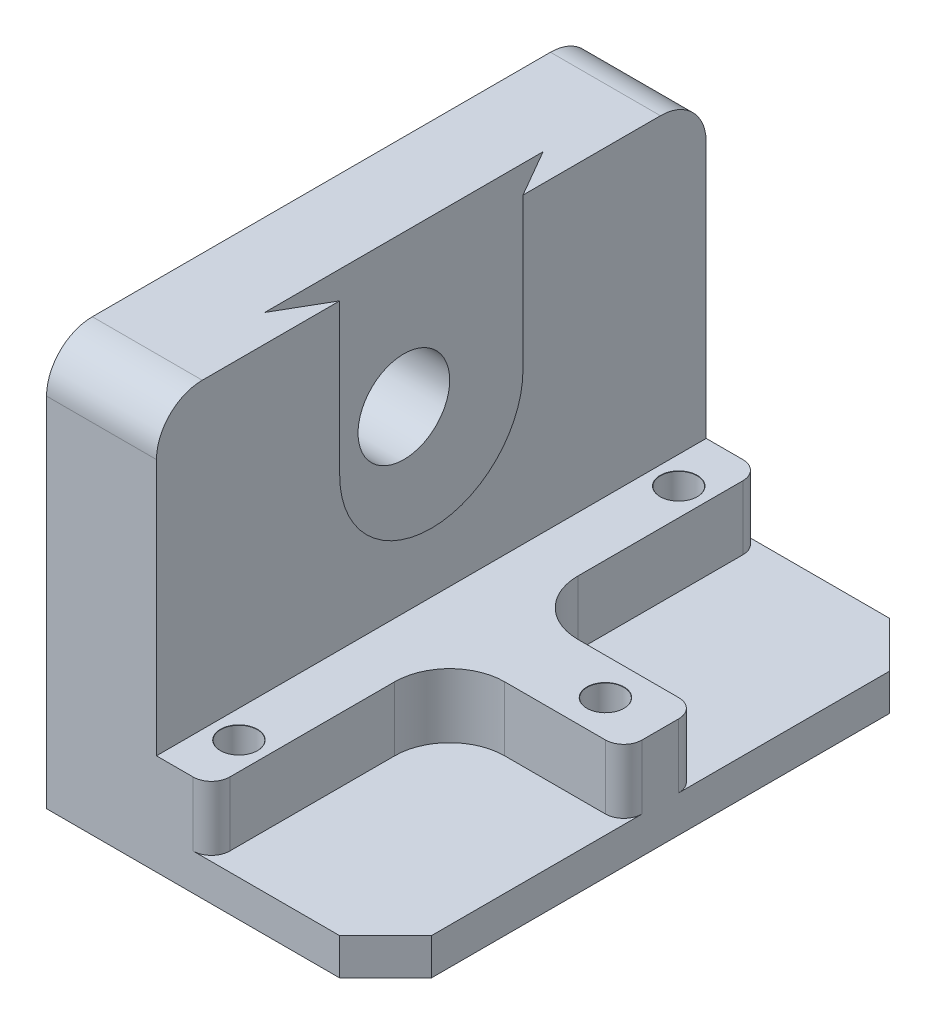
ISO-10303-21;
HEADER;
FILE_DESCRIPTION(('STEP AP214'),'2;1');
FILE_NAME('part.step','',(''),(''),'','','');
FILE_SCHEMA(('AUTOMOTIVE_DESIGN { 1 0 10303 214 1 1 1 1 }'));
ENDSEC;
DATA;
#1=APPLICATION_CONTEXT('core data for automotive mechanical design processes');
#2=APPLICATION_PROTOCOL_DEFINITION('international standard','automotive_design',2000,#1);
#3=PRODUCT_CONTEXT('',#1,'mechanical');
#4=PRODUCT('Part','Part','',(#3));
#5=PRODUCT_RELATED_PRODUCT_CATEGORY('part','',(#4));
#6=PRODUCT_DEFINITION_FORMATION('','',#4);
#7=PRODUCT_DEFINITION_CONTEXT('part definition',#1,'design');
#8=PRODUCT_DEFINITION('design','',#6,#7);
#9=PRODUCT_DEFINITION_SHAPE('','',#8);
#10=(LENGTH_UNIT() NAMED_UNIT(*) SI_UNIT(.MILLI.,.METRE.));
#11=(NAMED_UNIT(*) PLANE_ANGLE_UNIT() SI_UNIT($,.RADIAN.));
#12=(NAMED_UNIT(*) SI_UNIT($,.STERADIAN.) SOLID_ANGLE_UNIT());
#13=UNCERTAINTY_MEASURE_WITH_UNIT(LENGTH_MEASURE(1.E-05),#10,'distance_accuracy_value','');
#14=(GEOMETRIC_REPRESENTATION_CONTEXT(3) GLOBAL_UNCERTAINTY_ASSIGNED_CONTEXT((#13)) GLOBAL_UNIT_ASSIGNED_CONTEXT((#10,
#11,#12)) REPRESENTATION_CONTEXT('',''));
#15=CARTESIAN_POINT('',(0.,0.,0.));
#16=DIRECTION('',(0.,0.,1.));
#17=DIRECTION('',(1.,0.,0.));
#18=AXIS2_PLACEMENT_3D('',#15,#16,#17);
#19=CARTESIAN_POINT('',(12.,27.5,0.));
#20=DIRECTION('',(1.,0.,0.));
#21=DIRECTION('',(0.,0.,-1.));
#22=AXIS2_PLACEMENT_3D('',#19,#20,#21);
#23=CYLINDRICAL_SURFACE('',#22,5.);
#24=CARTESIAN_POINT('',(0.,27.5,0.));
#25=DIRECTION('',(1.,0.,0.));
#26=DIRECTION('',(0.,0.,-1.));
#27=AXIS2_PLACEMENT_3D('',#24,#25,#26);
#28=CIRCLE('',#27,5.);
#29=CARTESIAN_POINT('',(0.,27.5,-5.));
#30=VERTEX_POINT('',#29);
#31=EDGE_CURVE('E456',#30,#30,#28,.T.);
#32=ORIENTED_EDGE('',*,*,#31,.F.);
#33=EDGE_LOOP('',(#32));
#34=FACE_BOUND('',#33,.T.);
#35=CARTESIAN_POINT('',(9.00000000000001,27.5,0.));
#36=DIRECTION('',(1.,0.,0.));
#37=DIRECTION('',(0.,0.,-1.));
#38=AXIS2_PLACEMENT_3D('',#35,#36,#37);
#39=CIRCLE('',#38,5.);
#40=CARTESIAN_POINT('',(9.00000000000001,27.5,-5.));
#41=VERTEX_POINT('',#40);
#42=EDGE_CURVE('E405',#41,#41,#39,.F.);
#43=ORIENTED_EDGE('',*,*,#42,.F.);
#44=EDGE_LOOP('',(#43));
#45=FACE_BOUND('',#44,.T.);
#46=ADVANCED_FACE('F45',(#34,#45),#23,.F.);
#47=CARTESIAN_POINT('',(12.,4.,30.));
#48=DIRECTION('',(-1.,0.,0.));
#49=DIRECTION('',(0.,0.,1.));
#50=AXIS2_PLACEMENT_3D('',#47,#48,#49);
#51=PLANE('',#50);
#52=CARTESIAN_POINT('',(12.,27.5,0.));
#53=DIRECTION('',(1.,0.,0.));
#54=DIRECTION('',(0.,0.,-1.));
#55=AXIS2_PLACEMENT_3D('',#52,#53,#54);
#56=CIRCLE('',#55,10.);
#57=CARTESIAN_POINT('',(12.,27.5,10.));
#58=VERTEX_POINT('',#57);
#59=CARTESIAN_POINT('',(12.,27.5,-10.));
#60=VERTEX_POINT('',#59);
#61=EDGE_CURVE('E1023',#58,#60,#56,.T.);
#62=ORIENTED_EDGE('',*,*,#61,.F.);
#63=DIRECTION('',(0.,-1.,0.));
#64=VECTOR('',#63,1.);
#65=CARTESIAN_POINT('',(12.,42.375961669463,10.));
#66=LINE('',#65,#64);
#67=CARTESIAN_POINT('',(12.,44.,10.));
#68=VERTEX_POINT('',#67);
#69=EDGE_CURVE('E229',#68,#58,#66,.T.);
#70=ORIENTED_EDGE('',*,*,#69,.F.);
#71=DIRECTION('',(0.,0.,-1.));
#72=VECTOR('',#71,1.);
#73=CARTESIAN_POINT('',(12.,44.,30.));
#74=LINE('',#73,#72);
#75=CARTESIAN_POINT('',(12.,44.,25.));
#76=VERTEX_POINT('',#75);
#77=EDGE_CURVE('E246',#76,#68,#74,.T.);
#78=ORIENTED_EDGE('',*,*,#77,.F.);
#79=CARTESIAN_POINT('',(12.,39.,25.));
#80=DIRECTION('',(-1.,0.,0.));
#81=DIRECTION('',(0.,0.,1.));
#82=AXIS2_PLACEMENT_3D('',#79,#80,#81);
#83=CIRCLE('',#82,5.);
#84=CARTESIAN_POINT('',(12.,39.,30.));
#85=VERTEX_POINT('',#84);
#86=EDGE_CURVE('E69',#76,#85,#83,.F.);
#87=ORIENTED_EDGE('',*,*,#86,.T.);
#88=DIRECTION('',(0.,1.,0.));
#89=VECTOR('',#88,1.);
#90=CARTESIAN_POINT('',(12.,4.,30.));
#91=LINE('',#90,#89);
#92=CARTESIAN_POINT('',(12.,11.,30.));
#93=VERTEX_POINT('',#92);
#94=EDGE_CURVE('E247',#93,#85,#91,.T.);
#95=ORIENTED_EDGE('',*,*,#94,.F.);
#96=DIRECTION('',(0.,0.,1.));
#97=VECTOR('',#96,1.);
#98=CARTESIAN_POINT('',(12.,11.,-30.));
#99=LINE('',#98,#97);
#100=CARTESIAN_POINT('',(12.,11.,-30.));
#101=VERTEX_POINT('',#100);
#102=EDGE_CURVE('E461',#101,#93,#99,.T.);
#103=ORIENTED_EDGE('',*,*,#102,.F.);
#104=DIRECTION('',(0.,1.,0.));
#105=VECTOR('',#104,1.);
#106=CARTESIAN_POINT('',(12.,4.,-30.));
#107=LINE('',#106,#105);
#108=CARTESIAN_POINT('',(12.,39.,-30.));
#109=VERTEX_POINT('',#108);
#110=EDGE_CURVE('E256',#101,#109,#107,.T.);
#111=ORIENTED_EDGE('',*,*,#110,.T.);
#112=CARTESIAN_POINT('',(12.,39.,-25.));
#113=DIRECTION('',(-1.,0.,0.));
#114=DIRECTION('',(0.,0.,1.));
#115=AXIS2_PLACEMENT_3D('',#112,#113,#114);
#116=CIRCLE('',#115,5.);
#117=CARTESIAN_POINT('',(12.,44.,-25.));
#118=VERTEX_POINT('',#117);
#119=EDGE_CURVE('E243',#109,#118,#116,.F.);
#120=ORIENTED_EDGE('',*,*,#119,.T.);
#121=CARTESIAN_POINT('',(12.,44.,-10.));
#122=VERTEX_POINT('',#121);
#123=EDGE_CURVE('E235',#122,#118,#74,.T.);
#124=ORIENTED_EDGE('',*,*,#123,.F.);
#125=DIRECTION('',(0.,1.,0.));
#126=VECTOR('',#125,1.);
#127=CARTESIAN_POINT('',(12.,42.375961669463,-10.));
#128=LINE('',#127,#126);
#129=EDGE_CURVE('E220',#60,#122,#128,.T.);
#130=ORIENTED_EDGE('',*,*,#129,.F.);
#131=EDGE_LOOP('',(#62,#70,#78,#87,#95,#103,#111,#120,#124,#130));
#132=FACE_BOUND('',#131,.T.);
#133=ADVANCED_FACE('F240',(#132),#51,.F.);
#134=CARTESIAN_POINT('',(37.,4.,30.));
#135=DIRECTION('',(0.,-1.,0.));
#136=DIRECTION('',(1.,0.,0.));
#137=AXIS2_PLACEMENT_3D('',#134,#135,#136);
#138=PLANE('',#137);
#139=DIRECTION('',(1.,0.,0.));
#140=VECTOR('',#139,1.);
#141=CARTESIAN_POINT('',(18.,4.,4.));
#142=LINE('',#141,#140);
#143=CARTESIAN_POINT('',(24.,4.,4.));
#144=VERTEX_POINT('',#143);
#145=CARTESIAN_POINT('',(35.,4.,4.));
#146=VERTEX_POINT('',#145);
#147=EDGE_CURVE('E495',#144,#146,#142,.T.);
#148=ORIENTED_EDGE('',*,*,#147,.F.);
#149=CARTESIAN_POINT('',(24.,4.,10.));
#150=DIRECTION('',(0.,-1.,0.));
#151=DIRECTION('',(1.,0.,0.));
#152=AXIS2_PLACEMENT_3D('',#149,#150,#151);
#153=CIRCLE('',#152,6.);
#154=CARTESIAN_POINT('',(18.,4.,10.));
#155=VERTEX_POINT('',#154);
#156=EDGE_CURVE('E371',#144,#155,#153,.F.);
#157=ORIENTED_EDGE('',*,*,#156,.T.);
#158=DIRECTION('',(0.,0.,-1.));
#159=VECTOR('',#158,1.);
#160=CARTESIAN_POINT('',(18.,4.,30.));
#161=LINE('',#160,#159);
#162=CARTESIAN_POINT('',(18.,4.,28.));
#163=VERTEX_POINT('',#162);
#164=EDGE_CURVE('E460',#163,#155,#161,.T.);
#165=ORIENTED_EDGE('',*,*,#164,.F.);
#166=CARTESIAN_POINT('',(16.,4.,28.));
#167=DIRECTION('',(0.,-1.,0.));
#168=DIRECTION('',(1.,0.,0.));
#169=AXIS2_PLACEMENT_3D('',#166,#167,#168);
#170=CIRCLE('',#169,2.);
#171=CARTESIAN_POINT('',(16.,4.,30.));
#172=VERTEX_POINT('',#171);
#173=EDGE_CURVE('E353',#163,#172,#170,.T.);
#174=ORIENTED_EDGE('',*,*,#173,.T.);
#175=DIRECTION('',(-1.,0.,0.));
#176=VECTOR('',#175,1.);
#177=CARTESIAN_POINT('',(37.,4.,30.));
#178=LINE('',#177,#176);
#179=CARTESIAN_POINT('',(32.,4.,30.));
#180=VERTEX_POINT('',#179);
#181=EDGE_CURVE('E252',#180,#172,#178,.T.);
#182=ORIENTED_EDGE('',*,*,#181,.F.);
#183=DIRECTION('',(0.707106781186549,0.,-0.707106781186546));
#184=VECTOR('',#183,1.);
#185=CARTESIAN_POINT('',(32.,4.,30.));
#186=LINE('',#185,#184);
#187=CARTESIAN_POINT('',(37.,4.,25.));
#188=VERTEX_POINT('',#187);
#189=EDGE_CURVE('E296',#180,#188,#186,.T.);
#190=ORIENTED_EDGE('',*,*,#189,.T.);
#191=DIRECTION('',(0.,0.,-1.));
#192=VECTOR('',#191,1.);
#193=CARTESIAN_POINT('',(37.,4.,30.));
#194=LINE('',#193,#192);
#195=CARTESIAN_POINT('',(37.,4.,2.));
#196=VERTEX_POINT('',#195);
#197=EDGE_CURVE('E258',#188,#196,#194,.T.);
#198=ORIENTED_EDGE('',*,*,#197,.T.);
#199=CARTESIAN_POINT('',(35.,4.,2.));
#200=DIRECTION('',(0.,-1.,0.));
#201=DIRECTION('',(1.,0.,0.));
#202=AXIS2_PLACEMENT_3D('',#199,#200,#201);
#203=CIRCLE('',#202,2.);
#204=EDGE_CURVE('E345',#196,#146,#203,.T.);
#205=ORIENTED_EDGE('',*,*,#204,.T.);
#206=EDGE_LOOP('',(#148,#157,#165,#174,#182,#190,#198,#205));
#207=FACE_BOUND('',#206,.T.);
#208=ADVANCED_FACE('F596',(#207),#138,.F.);
#209=DIRECTION('',(0.,0.,-1.));
#210=VECTOR('',#209,1.);
#211=CARTESIAN_POINT('',(18.,4.,-30.));
#212=LINE('',#211,#210);
#213=CARTESIAN_POINT('',(18.,4.,-10.));
#214=VERTEX_POINT('',#213);
#215=CARTESIAN_POINT('',(18.,4.,-28.));
#216=VERTEX_POINT('',#215);
#217=EDGE_CURVE('E466',#214,#216,#212,.T.);
#218=ORIENTED_EDGE('',*,*,#217,.F.);
#219=CARTESIAN_POINT('',(24.,4.,-10.));
#220=DIRECTION('',(0.,-1.,0.));
#221=DIRECTION('',(1.,0.,0.));
#222=AXIS2_PLACEMENT_3D('',#219,#220,#221);
#223=CIRCLE('',#222,6.);
#224=CARTESIAN_POINT('',(24.,4.,-4.));
#225=VERTEX_POINT('',#224);
#226=EDGE_CURVE('E361',#214,#225,#223,.F.);
#227=ORIENTED_EDGE('',*,*,#226,.T.);
#228=DIRECTION('',(-1.,0.,0.));
#229=VECTOR('',#228,1.);
#230=CARTESIAN_POINT('',(18.,4.,-4.));
#231=LINE('',#230,#229);
#232=CARTESIAN_POINT('',(35.,4.,-4.));
#233=VERTEX_POINT('',#232);
#234=EDGE_CURVE('E498',#233,#225,#231,.T.);
#235=ORIENTED_EDGE('',*,*,#234,.F.);
#236=CARTESIAN_POINT('',(35.,4.,-2.));
#237=DIRECTION('',(0.,-1.,0.));
#238=DIRECTION('',(1.,0.,0.));
#239=AXIS2_PLACEMENT_3D('',#236,#237,#238);
#240=CIRCLE('',#239,2.);
#241=CARTESIAN_POINT('',(37.,4.,-2.));
#242=VERTEX_POINT('',#241);
#243=EDGE_CURVE('E341',#233,#242,#240,.T.);
#244=ORIENTED_EDGE('',*,*,#243,.T.);
#245=CARTESIAN_POINT('',(37.,4.,-25.));
#246=VERTEX_POINT('',#245);
#247=EDGE_CURVE('E251',#242,#246,#194,.T.);
#248=ORIENTED_EDGE('',*,*,#247,.T.);
#249=DIRECTION('',(0.707106781186549,0.,0.707106781186546));
#250=VECTOR('',#249,1.);
#251=CARTESIAN_POINT('',(37.,4.,-25.));
#252=LINE('',#251,#250);
#253=CARTESIAN_POINT('',(32.,4.,-30.));
#254=VERTEX_POINT('',#253);
#255=EDGE_CURVE('E280',#246,#254,#252,.F.);
#256=ORIENTED_EDGE('',*,*,#255,.T.);
#257=DIRECTION('',(-1.,0.,0.));
#258=VECTOR('',#257,1.);
#259=CARTESIAN_POINT('',(37.,4.,-30.));
#260=LINE('',#259,#258);
#261=CARTESIAN_POINT('',(16.,4.,-30.));
#262=VERTEX_POINT('',#261);
#263=EDGE_CURVE('E518',#254,#262,#260,.T.);
#264=ORIENTED_EDGE('',*,*,#263,.T.);
#265=CARTESIAN_POINT('',(16.,4.,-28.));
#266=DIRECTION('',(0.,-1.,0.));
#267=DIRECTION('',(1.,0.,0.));
#268=AXIS2_PLACEMENT_3D('',#265,#266,#267);
#269=CIRCLE('',#268,2.);
#270=EDGE_CURVE('E349',#262,#216,#269,.T.);
#271=ORIENTED_EDGE('',*,*,#270,.T.);
#272=EDGE_LOOP('',(#218,#227,#235,#244,#248,#256,#264,#271));
#273=FACE_BOUND('',#272,.T.);
#274=ADVANCED_FACE('F554',(#273),#138,.F.);
#275=CARTESIAN_POINT('',(12.,44.,30.));
#276=DIRECTION('',(0.,-1.,0.));
#277=DIRECTION('',(1.,0.,0.));
#278=AXIS2_PLACEMENT_3D('',#275,#276,#277);
#279=PLANE('',#278);
#280=ORIENTED_EDGE('',*,*,#77,.T.);
#281=DIRECTION('',(-0.499999999999998,0.,0.86602540378444));
#282=VECTOR('',#281,1.);
#283=CARTESIAN_POINT('',(3.33974596215564,44.,25.));
#284=LINE('',#283,#282);
#285=CARTESIAN_POINT('',(9.00000000000001,44.,15.1961524227067));
#286=VERTEX_POINT('',#285);
#287=EDGE_CURVE('E11',#68,#286,#284,.T.);
#288=ORIENTED_EDGE('',*,*,#287,.T.);
#289=DIRECTION('',(0.,0.,1.));
#290=VECTOR('',#289,1.);
#291=CARTESIAN_POINT('',(9.00000000000001,44.,30.));
#292=LINE('',#291,#290);
#293=CARTESIAN_POINT('',(9.00000000000001,44.,-15.1961524227067));
#294=VERTEX_POINT('',#293);
#295=EDGE_CURVE('E237',#294,#286,#292,.T.);
#296=ORIENTED_EDGE('',*,*,#295,.F.);
#297=DIRECTION('',(0.499999999999998,0.,0.86602540378444));
#298=VECTOR('',#297,1.);
#299=CARTESIAN_POINT('',(29.3205080756887,44.,20.0000000000001));
#300=LINE('',#299,#298);
#301=EDGE_CURVE('E54',#294,#122,#300,.T.);
#302=ORIENTED_EDGE('',*,*,#301,.T.);
#303=ORIENTED_EDGE('',*,*,#123,.T.);
#304=DIRECTION('',(-1.,0.,0.));
#305=VECTOR('',#304,1.);
#306=CARTESIAN_POINT('',(12.,44.,-25.));
#307=LINE('',#306,#305);
#308=CARTESIAN_POINT('',(0.,44.,-25.));
#309=VERTEX_POINT('',#308);
#310=EDGE_CURVE('E386',#118,#309,#307,.T.);
#311=ORIENTED_EDGE('',*,*,#310,.T.);
#312=DIRECTION('',(0.,0.,-1.));
#313=VECTOR('',#312,1.);
#314=CARTESIAN_POINT('',(0.,44.,30.));
#315=LINE('',#314,#313);
#316=CARTESIAN_POINT('',(0.,44.,25.));
#317=VERTEX_POINT('',#316);
#318=EDGE_CURVE('E269',#317,#309,#315,.T.);
#319=ORIENTED_EDGE('',*,*,#318,.F.);
#320=DIRECTION('',(-1.,0.,0.));
#321=VECTOR('',#320,1.);
#322=CARTESIAN_POINT('',(12.,44.,25.));
#323=LINE('',#322,#321);
#324=EDGE_CURVE('E383',#317,#76,#323,.F.);
#325=ORIENTED_EDGE('',*,*,#324,.T.);
#326=EDGE_LOOP('',(#280,#288,#296,#302,#303,#311,#319,#325));
#327=FACE_BOUND('',#326,.T.);
#328=ADVANCED_FACE('F233',(#327),#279,.F.);
#329=CARTESIAN_POINT('',(0.,44.,30.));
#330=DIRECTION('',(1.,0.,0.));
#331=DIRECTION('',(0.,0.,-1.));
#332=AXIS2_PLACEMENT_3D('',#329,#330,#331);
#333=PLANE('',#332);
#334=ORIENTED_EDGE('',*,*,#31,.T.);
#335=EDGE_LOOP('',(#334));
#336=FACE_BOUND('',#335,.T.);
#337=ORIENTED_EDGE('',*,*,#318,.T.);
#338=CARTESIAN_POINT('',(0.,39.,-25.));
#339=DIRECTION('',(1.,0.,0.));
#340=DIRECTION('',(0.,0.,-1.));
#341=AXIS2_PLACEMENT_3D('',#338,#339,#340);
#342=CIRCLE('',#341,5.);
#343=CARTESIAN_POINT('',(0.,39.,-30.));
#344=VERTEX_POINT('',#343);
#345=EDGE_CURVE('E392',#309,#344,#342,.F.);
#346=ORIENTED_EDGE('',*,*,#345,.T.);
#347=DIRECTION('',(0.,-1.,0.));
#348=VECTOR('',#347,1.);
#349=CARTESIAN_POINT('',(0.,44.,-30.));
#350=LINE('',#349,#348);
#351=CARTESIAN_POINT('',(0.,0.,-30.));
#352=VERTEX_POINT('',#351);
#353=EDGE_CURVE('E491',#344,#352,#350,.T.);
#354=ORIENTED_EDGE('',*,*,#353,.T.);
#355=DIRECTION('',(0.,0.,-1.));
#356=VECTOR('',#355,1.);
#357=CARTESIAN_POINT('',(0.,0.,30.));
#358=LINE('',#357,#356);
#359=CARTESIAN_POINT('',(0.,0.,30.));
#360=VERTEX_POINT('',#359);
#361=EDGE_CURVE('E265',#360,#352,#358,.T.);
#362=ORIENTED_EDGE('',*,*,#361,.F.);
#363=DIRECTION('',(0.,-1.,0.));
#364=VECTOR('',#363,1.);
#365=CARTESIAN_POINT('',(0.,44.,30.));
#366=LINE('',#365,#364);
#367=CARTESIAN_POINT('',(0.,39.,30.));
#368=VERTEX_POINT('',#367);
#369=EDGE_CURVE('E504',#368,#360,#366,.T.);
#370=ORIENTED_EDGE('',*,*,#369,.F.);
#371=CARTESIAN_POINT('',(0.,39.,25.));
#372=DIRECTION('',(1.,0.,0.));
#373=DIRECTION('',(0.,0.,-1.));
#374=AXIS2_PLACEMENT_3D('',#371,#372,#373);
#375=CIRCLE('',#374,5.);
#376=EDGE_CURVE('E389',#368,#317,#375,.F.);
#377=ORIENTED_EDGE('',*,*,#376,.T.);
#378=EDGE_LOOP('',(#337,#346,#354,#362,#370,#377));
#379=FACE_BOUND('',#378,.T.);
#380=ADVANCED_FACE('F534',(#336,#379),#333,.F.);
#381=CARTESIAN_POINT('',(0.,0.,30.));
#382=DIRECTION('',(0.,1.,0.));
#383=DIRECTION('',(0.,0.,1.));
#384=AXIS2_PLACEMENT_3D('',#381,#382,#383);
#385=PLANE('',#384);
#386=CARTESIAN_POINT('',(31.,0.,0.));
#387=DIRECTION('',(0.,1.,0.));
#388=DIRECTION('',(0.,0.,1.));
#389=AXIS2_PLACEMENT_3D('',#386,#387,#388);
#390=CIRCLE('',#389,2.);
#391=CARTESIAN_POINT('',(31.,0.,2.));
#392=VERTEX_POINT('',#391);
#393=EDGE_CURVE('E428',#392,#392,#390,.T.);
#394=ORIENTED_EDGE('',*,*,#393,.T.);
#395=EDGE_LOOP('',(#394));
#396=FACE_BOUND('',#395,.T.);
#397=CARTESIAN_POINT('',(15.,0.,24.));
#398=DIRECTION('',(0.,1.,0.));
#399=DIRECTION('',(0.,0.,1.));
#400=AXIS2_PLACEMENT_3D('',#397,#398,#399);
#401=CIRCLE('',#400,2.);
#402=CARTESIAN_POINT('',(15.,0.,26.));
#403=VERTEX_POINT('',#402);
#404=EDGE_CURVE('E440',#403,#403,#401,.T.);
#405=ORIENTED_EDGE('',*,*,#404,.T.);
#406=EDGE_LOOP('',(#405));
#407=FACE_BOUND('',#406,.T.);
#408=CARTESIAN_POINT('',(15.,0.,-24.));
#409=DIRECTION('',(0.,1.,0.));
#410=DIRECTION('',(0.,0.,1.));
#411=AXIS2_PLACEMENT_3D('',#408,#409,#410);
#412=CIRCLE('',#411,2.);
#413=CARTESIAN_POINT('',(15.,0.,-22.));
#414=VERTEX_POINT('',#413);
#415=EDGE_CURVE('E452',#414,#414,#412,.T.);
#416=ORIENTED_EDGE('',*,*,#415,.T.);
#417=EDGE_LOOP('',(#416));
#418=FACE_BOUND('',#417,.T.);
#419=DIRECTION('',(1.,0.,0.));
#420=VECTOR('',#419,1.);
#421=CARTESIAN_POINT('',(0.,0.,-30.));
#422=LINE('',#421,#420);
#423=CARTESIAN_POINT('',(32.,0.,-30.));
#424=VERTEX_POINT('',#423);
#425=EDGE_CURVE('E515',#352,#424,#422,.T.);
#426=ORIENTED_EDGE('',*,*,#425,.T.);
#427=DIRECTION('',(-0.707106781186549,0.,-0.707106781186546));
#428=VECTOR('',#427,1.);
#429=CARTESIAN_POINT('',(37.,0.,-25.));
#430=LINE('',#429,#428);
#431=CARTESIAN_POINT('',(37.,0.,-25.));
#432=VERTEX_POINT('',#431);
#433=EDGE_CURVE('E289',#424,#432,#430,.F.);
#434=ORIENTED_EDGE('',*,*,#433,.T.);
#435=DIRECTION('',(0.,0.,-1.));
#436=VECTOR('',#435,1.);
#437=CARTESIAN_POINT('',(37.,0.,30.));
#438=LINE('',#437,#436);
#439=CARTESIAN_POINT('',(37.,0.,25.));
#440=VERTEX_POINT('',#439);
#441=EDGE_CURVE('E261',#440,#432,#438,.T.);
#442=ORIENTED_EDGE('',*,*,#441,.F.);
#443=DIRECTION('',(-0.707106781186549,0.,0.707106781186546));
#444=VECTOR('',#443,1.);
#445=CARTESIAN_POINT('',(32.,0.,30.));
#446=LINE('',#445,#444);
#447=CARTESIAN_POINT('',(32.,0.,30.));
#448=VERTEX_POINT('',#447);
#449=EDGE_CURVE('E286',#440,#448,#446,.T.);
#450=ORIENTED_EDGE('',*,*,#449,.T.);
#451=DIRECTION('',(1.,0.,0.));
#452=VECTOR('',#451,1.);
#453=CARTESIAN_POINT('',(0.,0.,30.));
#454=LINE('',#453,#452);
#455=EDGE_CURVE('E507',#360,#448,#454,.T.);
#456=ORIENTED_EDGE('',*,*,#455,.F.);
#457=ORIENTED_EDGE('',*,*,#361,.T.);
#458=EDGE_LOOP('',(#426,#434,#442,#450,#456,#457));
#459=FACE_BOUND('',#458,.T.);
#460=ADVANCED_FACE('F585',(#396,#407,#418,#459),#385,.F.);
#461=CARTESIAN_POINT('',(37.,0.,30.));
#462=DIRECTION('',(-1.,0.,0.));
#463=DIRECTION('',(0.,0.,1.));
#464=AXIS2_PLACEMENT_3D('',#461,#462,#463);
#465=PLANE('',#464);
#466=ORIENTED_EDGE('',*,*,#247,.F.);
#467=DIRECTION('',(0.,-1.,0.));
#468=VECTOR('',#467,1.);
#469=CARTESIAN_POINT('',(37.,0.,-2.));
#470=LINE('',#469,#468);
#471=CARTESIAN_POINT('',(37.,11.,-2.));
#472=VERTEX_POINT('',#471);
#473=EDGE_CURVE('E307',#242,#472,#470,.F.);
#474=ORIENTED_EDGE('',*,*,#473,.T.);
#475=DIRECTION('',(0.,0.,-1.));
#476=VECTOR('',#475,1.);
#477=CARTESIAN_POINT('',(37.,11.,-4.));
#478=LINE('',#477,#476);
#479=CARTESIAN_POINT('',(37.,11.,2.));
#480=VERTEX_POINT('',#479);
#481=EDGE_CURVE('E477',#480,#472,#478,.T.);
#482=ORIENTED_EDGE('',*,*,#481,.F.);
#483=DIRECTION('',(0.,-1.,0.));
#484=VECTOR('',#483,1.);
#485=CARTESIAN_POINT('',(37.,0.,2.));
#486=LINE('',#485,#484);
#487=EDGE_CURVE('E303',#480,#196,#486,.T.);
#488=ORIENTED_EDGE('',*,*,#487,.T.);
#489=ORIENTED_EDGE('',*,*,#197,.F.);
#490=DIRECTION('',(0.,-1.,0.));
#491=VECTOR('',#490,1.);
#492=CARTESIAN_POINT('',(37.,0.,25.));
#493=LINE('',#492,#491);
#494=EDGE_CURVE('E273',#188,#440,#493,.T.);
#495=ORIENTED_EDGE('',*,*,#494,.T.);
#496=ORIENTED_EDGE('',*,*,#441,.T.);
#497=DIRECTION('',(0.,1.,0.));
#498=VECTOR('',#497,1.);
#499=CARTESIAN_POINT('',(37.,0.,-25.));
#500=LINE('',#499,#498);
#501=EDGE_CURVE('E276',#432,#246,#500,.T.);
#502=ORIENTED_EDGE('',*,*,#501,.T.);
#503=EDGE_LOOP('',(#466,#474,#482,#488,#489,#495,#496,#502));
#504=FACE_BOUND('',#503,.T.);
#505=ADVANCED_FACE('F576',(#504),#465,.F.);
#506=CARTESIAN_POINT('',(0.,0.,30.));
#507=DIRECTION('',(0.,0.,1.));
#508=DIRECTION('',(1.,0.,0.));
#509=AXIS2_PLACEMENT_3D('',#506,#507,#508);
#510=PLANE('',#509);
#511=ORIENTED_EDGE('',*,*,#94,.T.);
#512=DIRECTION('',(-1.,0.,0.));
#513=VECTOR('',#512,1.);
#514=CARTESIAN_POINT('',(0.,39.,30.));
#515=LINE('',#514,#513);
#516=EDGE_CURVE('E239',#85,#368,#515,.T.);
#517=ORIENTED_EDGE('',*,*,#516,.T.);
#518=ORIENTED_EDGE('',*,*,#369,.T.);
#519=ORIENTED_EDGE('',*,*,#455,.T.);
#520=DIRECTION('',(0.,1.,0.));
#521=VECTOR('',#520,1.);
#522=CARTESIAN_POINT('',(32.,4.,30.));
#523=LINE('',#522,#521);
#524=EDGE_CURVE('E292',#448,#180,#523,.T.);
#525=ORIENTED_EDGE('',*,*,#524,.T.);
#526=ORIENTED_EDGE('',*,*,#181,.T.);
#527=DIRECTION('',(0.,-1.,0.));
#528=VECTOR('',#527,1.);
#529=CARTESIAN_POINT('',(16.,11.,30.));
#530=LINE('',#529,#528);
#531=CARTESIAN_POINT('',(16.,11.,30.));
#532=VERTEX_POINT('',#531);
#533=EDGE_CURVE('E338',#172,#532,#530,.F.);
#534=ORIENTED_EDGE('',*,*,#533,.T.);
#535=DIRECTION('',(1.,0.,0.));
#536=VECTOR('',#535,1.);
#537=CARTESIAN_POINT('',(12.,11.,30.));
#538=LINE('',#537,#536);
#539=EDGE_CURVE('E465',#93,#532,#538,.T.);
#540=ORIENTED_EDGE('',*,*,#539,.F.);
#541=EDGE_LOOP('',(#511,#517,#518,#519,#525,#526,#534,#540));
#542=FACE_BOUND('',#541,.T.);
#543=ADVANCED_FACE('F541',(#542),#510,.T.);
#544=CARTESIAN_POINT('',(0.,0.,-30.));
#545=DIRECTION('',(0.,0.,1.));
#546=DIRECTION('',(1.,0.,0.));
#547=AXIS2_PLACEMENT_3D('',#544,#545,#546);
#548=PLANE('',#547);
#549=ORIENTED_EDGE('',*,*,#353,.F.);
#550=DIRECTION('',(-1.,0.,0.));
#551=VECTOR('',#550,1.);
#552=CARTESIAN_POINT('',(0.,39.,-30.));
#553=LINE('',#552,#551);
#554=EDGE_CURVE('E395',#344,#109,#553,.F.);
#555=ORIENTED_EDGE('',*,*,#554,.T.);
#556=ORIENTED_EDGE('',*,*,#110,.F.);
#557=DIRECTION('',(-1.,0.,0.));
#558=VECTOR('',#557,1.);
#559=CARTESIAN_POINT('',(12.,11.,-30.));
#560=LINE('',#559,#558);
#561=CARTESIAN_POINT('',(16.,11.,-30.));
#562=VERTEX_POINT('',#561);
#563=EDGE_CURVE('E488',#562,#101,#560,.T.);
#564=ORIENTED_EDGE('',*,*,#563,.F.);
#565=DIRECTION('',(0.,-1.,0.));
#566=VECTOR('',#565,1.);
#567=CARTESIAN_POINT('',(16.,0.,-30.));
#568=LINE('',#567,#566);
#569=EDGE_CURVE('E326',#562,#262,#568,.T.);
#570=ORIENTED_EDGE('',*,*,#569,.T.);
#571=ORIENTED_EDGE('',*,*,#263,.F.);
#572=DIRECTION('',(0.,-1.,0.));
#573=VECTOR('',#572,1.);
#574=CARTESIAN_POINT('',(32.,0.,-30.));
#575=LINE('',#574,#573);
#576=EDGE_CURVE('E283',#254,#424,#575,.T.);
#577=ORIENTED_EDGE('',*,*,#576,.T.);
#578=ORIENTED_EDGE('',*,*,#425,.F.);
#579=EDGE_LOOP('',(#549,#555,#556,#564,#570,#571,#577,#578));
#580=FACE_BOUND('',#579,.T.);
#581=ADVANCED_FACE('F549',(#580),#548,.F.);
#582=CARTESIAN_POINT('',(18.,11.,30.));
#583=DIRECTION('',(-1.,0.,0.));
#584=DIRECTION('',(0.,0.,1.));
#585=AXIS2_PLACEMENT_3D('',#582,#583,#584);
#586=PLANE('',#585);
#587=ORIENTED_EDGE('',*,*,#164,.T.);
#588=DIRECTION('',(0.,-1.,0.));
#589=VECTOR('',#588,1.);
#590=CARTESIAN_POINT('',(18.,11.,10.));
#591=LINE('',#590,#589);
#592=CARTESIAN_POINT('',(18.,11.,10.));
#593=VERTEX_POINT('',#592);
#594=EDGE_CURVE('E374',#155,#593,#591,.F.);
#595=ORIENTED_EDGE('',*,*,#594,.T.);
#596=DIRECTION('',(0.,0.,-1.));
#597=VECTOR('',#596,1.);
#598=CARTESIAN_POINT('',(18.,11.,30.));
#599=LINE('',#598,#597);
#600=CARTESIAN_POINT('',(18.,11.,28.));
#601=VERTEX_POINT('',#600);
#602=EDGE_CURVE('E470',#601,#593,#599,.T.);
#603=ORIENTED_EDGE('',*,*,#602,.F.);
#604=DIRECTION('',(0.,-1.,0.));
#605=VECTOR('',#604,1.);
#606=CARTESIAN_POINT('',(18.,4.,28.));
#607=LINE('',#606,#605);
#608=EDGE_CURVE('E334',#601,#163,#607,.T.);
#609=ORIENTED_EDGE('',*,*,#608,.T.);
#610=EDGE_LOOP('',(#587,#595,#603,#609));
#611=FACE_BOUND('',#610,.T.);
#612=ADVANCED_FACE('F614',(#611),#586,.F.);
#613=CARTESIAN_POINT('',(18.,11.,4.));
#614=DIRECTION('',(0.,0.,-1.));
#615=DIRECTION('',(-1.,0.,0.));
#616=AXIS2_PLACEMENT_3D('',#613,#614,#615);
#617=PLANE('',#616);
#618=DIRECTION('',(1.,0.,0.));
#619=VECTOR('',#618,1.);
#620=CARTESIAN_POINT('',(18.,11.,4.));
#621=LINE('',#620,#619);
#622=CARTESIAN_POINT('',(24.,11.,4.));
#623=VERTEX_POINT('',#622);
#624=CARTESIAN_POINT('',(35.,11.,4.));
#625=VERTEX_POINT('',#624);
#626=EDGE_CURVE('E474',#623,#625,#621,.T.);
#627=ORIENTED_EDGE('',*,*,#626,.F.);
#628=DIRECTION('',(0.,-1.,0.));
#629=VECTOR('',#628,1.);
#630=CARTESIAN_POINT('',(24.,4.,4.));
#631=LINE('',#630,#629);
#632=EDGE_CURVE('E367',#623,#144,#631,.T.);
#633=ORIENTED_EDGE('',*,*,#632,.T.);
#634=ORIENTED_EDGE('',*,*,#147,.T.);
#635=DIRECTION('',(0.,-1.,0.));
#636=VECTOR('',#635,1.);
#637=CARTESIAN_POINT('',(35.,11.,4.));
#638=LINE('',#637,#636);
#639=EDGE_CURVE('E322',#146,#625,#638,.F.);
#640=ORIENTED_EDGE('',*,*,#639,.T.);
#641=EDGE_LOOP('',(#627,#633,#634,#640));
#642=FACE_BOUND('',#641,.T.);
#643=ADVANCED_FACE('F606',(#642),#617,.F.);
#644=CARTESIAN_POINT('',(18.,11.,-4.));
#645=DIRECTION('',(0.,0.,1.));
#646=DIRECTION('',(1.,0.,0.));
#647=AXIS2_PLACEMENT_3D('',#644,#645,#646);
#648=PLANE('',#647);
#649=ORIENTED_EDGE('',*,*,#234,.T.);
#650=DIRECTION('',(0.,-1.,0.));
#651=VECTOR('',#650,1.);
#652=CARTESIAN_POINT('',(24.,11.,-4.));
#653=LINE('',#652,#651);
#654=CARTESIAN_POINT('',(24.,11.,-4.));
#655=VERTEX_POINT('',#654);
#656=EDGE_CURVE('E364',#225,#655,#653,.F.);
#657=ORIENTED_EDGE('',*,*,#656,.T.);
#658=DIRECTION('',(-1.,0.,0.));
#659=VECTOR('',#658,1.);
#660=CARTESIAN_POINT('',(18.,11.,-4.));
#661=LINE('',#660,#659);
#662=CARTESIAN_POINT('',(35.,11.,-4.));
#663=VERTEX_POINT('',#662);
#664=EDGE_CURVE('E481',#663,#655,#661,.T.);
#665=ORIENTED_EDGE('',*,*,#664,.F.);
#666=DIRECTION('',(0.,-1.,0.));
#667=VECTOR('',#666,1.);
#668=CARTESIAN_POINT('',(35.,11.,-4.));
#669=LINE('',#668,#667);
#670=EDGE_CURVE('E299',#663,#233,#669,.T.);
#671=ORIENTED_EDGE('',*,*,#670,.T.);
#672=EDGE_LOOP('',(#649,#657,#665,#671));
#673=FACE_BOUND('',#672,.T.);
#674=ADVANCED_FACE('F566',(#673),#648,.F.);
#675=CARTESIAN_POINT('',(18.,11.,-30.));
#676=DIRECTION('',(-1.,0.,0.));
#677=DIRECTION('',(0.,0.,1.));
#678=AXIS2_PLACEMENT_3D('',#675,#676,#677);
#679=PLANE('',#678);
#680=DIRECTION('',(0.,0.,-1.));
#681=VECTOR('',#680,1.);
#682=CARTESIAN_POINT('',(18.,11.,-30.));
#683=LINE('',#682,#681);
#684=CARTESIAN_POINT('',(18.,11.,-10.));
#685=VERTEX_POINT('',#684);
#686=CARTESIAN_POINT('',(18.,11.,-28.));
#687=VERTEX_POINT('',#686);
#688=EDGE_CURVE('E485',#685,#687,#683,.T.);
#689=ORIENTED_EDGE('',*,*,#688,.F.);
#690=DIRECTION('',(0.,-1.,0.));
#691=VECTOR('',#690,1.);
#692=CARTESIAN_POINT('',(18.,4.,-10.));
#693=LINE('',#692,#691);
#694=EDGE_CURVE('E357',#685,#214,#693,.T.);
#695=ORIENTED_EDGE('',*,*,#694,.T.);
#696=ORIENTED_EDGE('',*,*,#217,.T.);
#697=DIRECTION('',(0.,-1.,0.));
#698=VECTOR('',#697,1.);
#699=CARTESIAN_POINT('',(18.,11.,-28.));
#700=LINE('',#699,#698);
#701=EDGE_CURVE('E330',#216,#687,#700,.F.);
#702=ORIENTED_EDGE('',*,*,#701,.T.);
#703=EDGE_LOOP('',(#689,#695,#696,#702));
#704=FACE_BOUND('',#703,.T.);
#705=ADVANCED_FACE('F558',(#704),#679,.F.);
#706=CARTESIAN_POINT('',(0.,11.,0.));
#707=DIRECTION('',(0.,1.,0.));
#708=DIRECTION('',(-1.,0.,0.));
#709=AXIS2_PLACEMENT_3D('',#706,#707,#708);
#710=PLANE('',#709);
#711=CARTESIAN_POINT('',(31.,11.,0.));
#712=DIRECTION('',(0.,1.,0.));
#713=DIRECTION('',(0.,0.,1.));
#714=AXIS2_PLACEMENT_3D('',#711,#712,#713);
#715=CIRCLE('',#714,2.025);
#716=CARTESIAN_POINT('',(31.,11.,2.025));
#717=VERTEX_POINT('',#716);
#718=EDGE_CURVE('E412',#717,#717,#715,.T.);
#719=ORIENTED_EDGE('',*,*,#718,.F.);
#720=EDGE_LOOP('',(#719));
#721=FACE_BOUND('',#720,.T.);
#722=CARTESIAN_POINT('',(15.,11.,24.));
#723=DIRECTION('',(0.,1.,0.));
#724=DIRECTION('',(0.,0.,1.));
#725=AXIS2_PLACEMENT_3D('',#722,#723,#724);
#726=CIRCLE('',#725,2.025);
#727=CARTESIAN_POINT('',(15.,11.,26.025));
#728=VERTEX_POINT('',#727);
#729=EDGE_CURVE('E432',#728,#728,#726,.T.);
#730=ORIENTED_EDGE('',*,*,#729,.F.);
#731=EDGE_LOOP('',(#730));
#732=FACE_BOUND('',#731,.T.);
#733=CARTESIAN_POINT('',(15.,11.,-24.));
#734=DIRECTION('',(0.,1.,0.));
#735=DIRECTION('',(0.,0.,1.));
#736=AXIS2_PLACEMENT_3D('',#733,#734,#735);
#737=CIRCLE('',#736,2.025);
#738=CARTESIAN_POINT('',(15.,11.,-21.975));
#739=VERTEX_POINT('',#738);
#740=EDGE_CURVE('E444',#739,#739,#737,.T.);
#741=ORIENTED_EDGE('',*,*,#740,.F.);
#742=EDGE_LOOP('',(#741));
#743=FACE_BOUND('',#742,.T.);
#744=ORIENTED_EDGE('',*,*,#481,.T.);
#745=CARTESIAN_POINT('',(35.,11.,-2.));
#746=DIRECTION('',(0.,1.,0.));
#747=DIRECTION('',(-1.,0.,0.));
#748=AXIS2_PLACEMENT_3D('',#745,#746,#747);
#749=CIRCLE('',#748,2.);
#750=EDGE_CURVE('E319',#472,#663,#749,.T.);
#751=ORIENTED_EDGE('',*,*,#750,.T.);
#752=ORIENTED_EDGE('',*,*,#664,.T.);
#753=CARTESIAN_POINT('',(24.,11.,-10.));
#754=DIRECTION('',(0.,1.,0.));
#755=DIRECTION('',(-1.,0.,0.));
#756=AXIS2_PLACEMENT_3D('',#753,#754,#755);
#757=CIRCLE('',#756,6.);
#758=EDGE_CURVE('E377',#655,#685,#757,.F.);
#759=ORIENTED_EDGE('',*,*,#758,.T.);
#760=ORIENTED_EDGE('',*,*,#688,.T.);
#761=CARTESIAN_POINT('',(16.,11.,-28.));
#762=DIRECTION('',(0.,1.,0.));
#763=DIRECTION('',(-1.,0.,0.));
#764=AXIS2_PLACEMENT_3D('',#761,#762,#763);
#765=CIRCLE('',#764,2.);
#766=EDGE_CURVE('E313',#687,#562,#765,.T.);
#767=ORIENTED_EDGE('',*,*,#766,.T.);
#768=ORIENTED_EDGE('',*,*,#563,.T.);
#769=ORIENTED_EDGE('',*,*,#102,.T.);
#770=ORIENTED_EDGE('',*,*,#539,.T.);
#771=CARTESIAN_POINT('',(16.,11.,28.));
#772=DIRECTION('',(0.,1.,0.));
#773=DIRECTION('',(-1.,0.,0.));
#774=AXIS2_PLACEMENT_3D('',#771,#772,#773);
#775=CIRCLE('',#774,2.);
#776=EDGE_CURVE('E310',#532,#601,#775,.T.);
#777=ORIENTED_EDGE('',*,*,#776,.T.);
#778=ORIENTED_EDGE('',*,*,#602,.T.);
#779=CARTESIAN_POINT('',(24.,11.,10.));
#780=DIRECTION('',(0.,1.,0.));
#781=DIRECTION('',(-1.,0.,0.));
#782=AXIS2_PLACEMENT_3D('',#779,#780,#781);
#783=CIRCLE('',#782,6.);
#784=EDGE_CURVE('E380',#593,#623,#783,.F.);
#785=ORIENTED_EDGE('',*,*,#784,.T.);
#786=ORIENTED_EDGE('',*,*,#626,.T.);
#787=CARTESIAN_POINT('',(35.,11.,2.));
#788=DIRECTION('',(0.,1.,0.));
#789=DIRECTION('',(-1.,0.,0.));
#790=AXIS2_PLACEMENT_3D('',#787,#788,#789);
#791=CIRCLE('',#790,2.);
#792=EDGE_CURVE('E316',#625,#480,#791,.T.);
#793=ORIENTED_EDGE('',*,*,#792,.T.);
#794=EDGE_LOOP('',(#744,#751,#752,#759,#760,#767,#768,#769,#770,#777,#778,#785,#786,#793));
#795=FACE_BOUND('',#794,.T.);
#796=ADVANCED_FACE('F546',(#721,#732,#743,#795),#710,.T.);
#797=CARTESIAN_POINT('',(15.,11.,-24.));
#798=DIRECTION('',(0.,1.,0.));
#799=DIRECTION('',(0.,0.,1.));
#800=AXIS2_PLACEMENT_3D('',#797,#798,#799);
#801=CYLINDRICAL_SURFACE('',#800,2.);
#802=ORIENTED_EDGE('',*,*,#415,.F.);
#803=EDGE_LOOP('',(#802));
#804=FACE_BOUND('',#803,.T.);
#805=CARTESIAN_POINT('',(15.,10.975,-24.));
#806=DIRECTION('',(0.,1.,0.));
#807=DIRECTION('',(0.,0.,1.));
#808=AXIS2_PLACEMENT_3D('',#805,#806,#807);
#809=CIRCLE('',#808,2.);
#810=CARTESIAN_POINT('',(15.,10.975,-22.));
#811=VERTEX_POINT('',#810);
#812=EDGE_CURVE('E448',#811,#811,#809,.T.);
#813=ORIENTED_EDGE('',*,*,#812,.T.);
#814=EDGE_LOOP('',(#813));
#815=FACE_BOUND('',#814,.T.);
#816=ADVANCED_FACE('F637',(#804,#815),#801,.F.);
#817=CARTESIAN_POINT('',(15.,11.,-24.));
#818=DIRECTION('',(0.,1.,0.));
#819=DIRECTION('',(0.,0.,1.));
#820=AXIS2_PLACEMENT_3D('',#817,#818,#819);
#821=CONICAL_SURFACE('',#820,2.025,0.785398163397448);
#822=ORIENTED_EDGE('',*,*,#812,.F.);
#823=EDGE_LOOP('',(#822));
#824=FACE_BOUND('',#823,.T.);
#825=ORIENTED_EDGE('',*,*,#740,.T.);
#826=EDGE_LOOP('',(#825));
#827=FACE_BOUND('',#826,.T.);
#828=ADVANCED_FACE('F888',(#824,#827),#821,.F.);
#829=CARTESIAN_POINT('',(15.,11.,24.));
#830=DIRECTION('',(0.,1.,0.));
#831=DIRECTION('',(0.,0.,1.));
#832=AXIS2_PLACEMENT_3D('',#829,#830,#831);
#833=CYLINDRICAL_SURFACE('',#832,2.);
#834=ORIENTED_EDGE('',*,*,#404,.F.);
#835=EDGE_LOOP('',(#834));
#836=FACE_BOUND('',#835,.T.);
#837=CARTESIAN_POINT('',(15.,10.975,24.));
#838=DIRECTION('',(0.,1.,0.));
#839=DIRECTION('',(0.,0.,1.));
#840=AXIS2_PLACEMENT_3D('',#837,#838,#839);
#841=CIRCLE('',#840,2.);
#842=CARTESIAN_POINT('',(15.,10.975,26.));
#843=VERTEX_POINT('',#842);
#844=EDGE_CURVE('E436',#843,#843,#841,.T.);
#845=ORIENTED_EDGE('',*,*,#844,.T.);
#846=EDGE_LOOP('',(#845));
#847=FACE_BOUND('',#846,.T.);
#848=ADVANCED_FACE('F885',(#836,#847),#833,.F.);
#849=CARTESIAN_POINT('',(15.,11.,24.));
#850=DIRECTION('',(0.,1.,0.));
#851=DIRECTION('',(0.,0.,1.));
#852=AXIS2_PLACEMENT_3D('',#849,#850,#851);
#853=CONICAL_SURFACE('',#852,2.025,0.785398163397448);
#854=ORIENTED_EDGE('',*,*,#844,.F.);
#855=EDGE_LOOP('',(#854));
#856=FACE_BOUND('',#855,.T.);
#857=ORIENTED_EDGE('',*,*,#729,.T.);
#858=EDGE_LOOP('',(#857));
#859=FACE_BOUND('',#858,.T.);
#860=ADVANCED_FACE('F881',(#856,#859),#853,.F.);
#861=CARTESIAN_POINT('',(31.,11.,0.));
#862=DIRECTION('',(0.,1.,0.));
#863=DIRECTION('',(0.,0.,1.));
#864=AXIS2_PLACEMENT_3D('',#861,#862,#863);
#865=CYLINDRICAL_SURFACE('',#864,2.);
#866=ORIENTED_EDGE('',*,*,#393,.F.);
#867=EDGE_LOOP('',(#866));
#868=FACE_BOUND('',#867,.T.);
#869=CARTESIAN_POINT('',(31.,10.975,0.));
#870=DIRECTION('',(0.,1.,0.));
#871=DIRECTION('',(0.,0.,1.));
#872=AXIS2_PLACEMENT_3D('',#869,#870,#871);
#873=CIRCLE('',#872,2.);
#874=CARTESIAN_POINT('',(31.,10.975,2.));
#875=VERTEX_POINT('',#874);
#876=EDGE_CURVE('E424',#875,#875,#873,.T.);
#877=ORIENTED_EDGE('',*,*,#876,.T.);
#878=EDGE_LOOP('',(#877));
#879=FACE_BOUND('',#878,.T.);
#880=ADVANCED_FACE('F877',(#868,#879),#865,.F.);
#881=CARTESIAN_POINT('',(31.,11.,0.));
#882=DIRECTION('',(0.,1.,0.));
#883=DIRECTION('',(0.,0.,1.));
#884=AXIS2_PLACEMENT_3D('',#881,#882,#883);
#885=CONICAL_SURFACE('',#884,2.025,0.785398163397379);
#886=ORIENTED_EDGE('',*,*,#876,.F.);
#887=EDGE_LOOP('',(#886));
#888=FACE_BOUND('',#887,.T.);
#889=ORIENTED_EDGE('',*,*,#718,.T.);
#890=EDGE_LOOP('',(#889));
#891=FACE_BOUND('',#890,.T.);
#892=ADVANCED_FACE('F672',(#888,#891),#885,.F.);
#893=CARTESIAN_POINT('',(37.,0.,-25.));
#894=DIRECTION('',(-0.707106781186546,0.,0.707106781186549));
#895=DIRECTION('',(0.,1.,0.));
#896=AXIS2_PLACEMENT_3D('',#893,#894,#895);
#897=PLANE('',#896);
#898=ORIENTED_EDGE('',*,*,#433,.F.);
#899=ORIENTED_EDGE('',*,*,#576,.F.);
#900=ORIENTED_EDGE('',*,*,#255,.F.);
#901=ORIENTED_EDGE('',*,*,#501,.F.);
#902=EDGE_LOOP('',(#898,#899,#900,#901));
#903=FACE_BOUND('',#902,.T.);
#904=ADVANCED_FACE('F581',(#903),#897,.F.);
#905=CARTESIAN_POINT('',(32.,0.,30.));
#906=DIRECTION('',(0.707106781186546,0.,0.707106781186549));
#907=DIRECTION('',(0.,-1.,0.));
#908=AXIS2_PLACEMENT_3D('',#905,#906,#907);
#909=PLANE('',#908);
#910=ORIENTED_EDGE('',*,*,#449,.F.);
#911=ORIENTED_EDGE('',*,*,#494,.F.);
#912=ORIENTED_EDGE('',*,*,#189,.F.);
#913=ORIENTED_EDGE('',*,*,#524,.F.);
#914=EDGE_LOOP('',(#910,#911,#912,#913));
#915=FACE_BOUND('',#914,.T.);
#916=ADVANCED_FACE('F591',(#915),#909,.T.);
#917=CARTESIAN_POINT('',(35.,11.,-2.));
#918=DIRECTION('',(0.,-1.,0.));
#919=DIRECTION('',(0.,0.,-1.));
#920=AXIS2_PLACEMENT_3D('',#917,#918,#919);
#921=CYLINDRICAL_SURFACE('',#920,2.);
#922=ORIENTED_EDGE('',*,*,#750,.F.);
#923=ORIENTED_EDGE('',*,*,#473,.F.);
#924=ORIENTED_EDGE('',*,*,#243,.F.);
#925=ORIENTED_EDGE('',*,*,#670,.F.);
#926=EDGE_LOOP('',(#922,#923,#924,#925));
#927=FACE_BOUND('',#926,.T.);
#928=ADVANCED_FACE('F572',(#927),#921,.T.);
#929=CARTESIAN_POINT('',(35.,0.,2.));
#930=DIRECTION('',(0.,-1.,0.));
#931=DIRECTION('',(0.,0.,-1.));
#932=AXIS2_PLACEMENT_3D('',#929,#930,#931);
#933=CYLINDRICAL_SURFACE('',#932,2.);
#934=ORIENTED_EDGE('',*,*,#792,.F.);
#935=ORIENTED_EDGE('',*,*,#639,.F.);
#936=ORIENTED_EDGE('',*,*,#204,.F.);
#937=ORIENTED_EDGE('',*,*,#487,.F.);
#938=EDGE_LOOP('',(#934,#935,#936,#937));
#939=FACE_BOUND('',#938,.T.);
#940=ADVANCED_FACE('F601',(#939),#933,.T.);
#941=CARTESIAN_POINT('',(16.,0.,-28.));
#942=DIRECTION('',(0.,-1.,0.));
#943=DIRECTION('',(1.,0.,0.));
#944=AXIS2_PLACEMENT_3D('',#941,#942,#943);
#945=CYLINDRICAL_SURFACE('',#944,2.);
#946=ORIENTED_EDGE('',*,*,#766,.F.);
#947=ORIENTED_EDGE('',*,*,#701,.F.);
#948=ORIENTED_EDGE('',*,*,#270,.F.);
#949=ORIENTED_EDGE('',*,*,#569,.F.);
#950=EDGE_LOOP('',(#946,#947,#948,#949));
#951=FACE_BOUND('',#950,.T.);
#952=ADVANCED_FACE('F551',(#951),#945,.T.);
#953=CARTESIAN_POINT('',(16.,11.,28.));
#954=DIRECTION('',(0.,1.,0.));
#955=DIRECTION('',(-1.,0.,0.));
#956=AXIS2_PLACEMENT_3D('',#953,#954,#955);
#957=CYLINDRICAL_SURFACE('',#956,2.);
#958=ORIENTED_EDGE('',*,*,#776,.F.);
#959=ORIENTED_EDGE('',*,*,#533,.F.);
#960=ORIENTED_EDGE('',*,*,#173,.F.);
#961=ORIENTED_EDGE('',*,*,#608,.F.);
#962=EDGE_LOOP('',(#958,#959,#960,#961));
#963=FACE_BOUND('',#962,.T.);
#964=ADVANCED_FACE('F617',(#963),#957,.T.);
#965=CARTESIAN_POINT('',(24.,11.,-10.));
#966=DIRECTION('',(0.,1.,0.));
#967=DIRECTION('',(-1.,0.,0.));
#968=AXIS2_PLACEMENT_3D('',#965,#966,#967);
#969=CYLINDRICAL_SURFACE('',#968,6.);
#970=ORIENTED_EDGE('',*,*,#758,.F.);
#971=ORIENTED_EDGE('',*,*,#656,.F.);
#972=ORIENTED_EDGE('',*,*,#226,.F.);
#973=ORIENTED_EDGE('',*,*,#694,.F.);
#974=EDGE_LOOP('',(#970,#971,#972,#973));
#975=FACE_BOUND('',#974,.T.);
#976=ADVANCED_FACE('F562',(#975),#969,.F.);
#977=CARTESIAN_POINT('',(24.,11.,10.));
#978=DIRECTION('',(0.,1.,0.));
#979=DIRECTION('',(-1.,0.,0.));
#980=AXIS2_PLACEMENT_3D('',#977,#978,#979);
#981=CYLINDRICAL_SURFACE('',#980,6.);
#982=ORIENTED_EDGE('',*,*,#784,.F.);
#983=ORIENTED_EDGE('',*,*,#594,.F.);
#984=ORIENTED_EDGE('',*,*,#156,.F.);
#985=ORIENTED_EDGE('',*,*,#632,.F.);
#986=EDGE_LOOP('',(#982,#983,#984,#985));
#987=FACE_BOUND('',#986,.T.);
#988=ADVANCED_FACE('F610',(#987),#981,.F.);
#989=CARTESIAN_POINT('',(12.,39.,-25.));
#990=DIRECTION('',(-1.,0.,0.));
#991=DIRECTION('',(0.,-1.,0.));
#992=AXIS2_PLACEMENT_3D('',#989,#990,#991);
#993=CYLINDRICAL_SURFACE('',#992,5.);
#994=ORIENTED_EDGE('',*,*,#119,.F.);
#995=ORIENTED_EDGE('',*,*,#554,.F.);
#996=ORIENTED_EDGE('',*,*,#345,.F.);
#997=ORIENTED_EDGE('',*,*,#310,.F.);
#998=EDGE_LOOP('',(#994,#995,#996,#997));
#999=FACE_BOUND('',#998,.T.);
#1000=ADVANCED_FACE('F530',(#999),#993,.T.);
#1001=CARTESIAN_POINT('',(0.,39.,25.));
#1002=DIRECTION('',(1.,0.,0.));
#1003=DIRECTION('',(0.,1.,0.));
#1004=AXIS2_PLACEMENT_3D('',#1001,#1002,#1003);
#1005=CYLINDRICAL_SURFACE('',#1004,5.);
#1006=ORIENTED_EDGE('',*,*,#86,.F.);
#1007=ORIENTED_EDGE('',*,*,#324,.F.);
#1008=ORIENTED_EDGE('',*,*,#376,.F.);
#1009=ORIENTED_EDGE('',*,*,#516,.F.);
#1010=EDGE_LOOP('',(#1006,#1007,#1008,#1009));
#1011=FACE_BOUND('',#1010,.T.);
#1012=ADVANCED_FACE('F47',(#1011),#1005,.T.);
#1013=CARTESIAN_POINT('',(12.,42.375961669463,10.));
#1014=DIRECTION('',(0.86602540378444,0.,0.499999999999998));
#1015=DIRECTION('',(0.499999999999998,0.,-0.86602540378444));
#1016=AXIS2_PLACEMENT_3D('',#1013,#1014,#1015);
#1017=PLANE('',#1016);
#1018=ORIENTED_EDGE('',*,*,#69,.T.);
#1019=DIRECTION('',(-0.499999999999998,0.,0.86602540378444));
#1020=VECTOR('',#1019,1.);
#1021=CARTESIAN_POINT('',(12.,27.5,10.));
#1022=LINE('',#1021,#1020);
#1023=CARTESIAN_POINT('',(9.00000000000001,27.5,15.1961524227067));
#1024=VERTEX_POINT('',#1023);
#1025=EDGE_CURVE('E414',#1024,#58,#1022,.F.);
#1026=ORIENTED_EDGE('',*,*,#1025,.F.);
#1027=DIRECTION('',(0.,-1.,0.));
#1028=VECTOR('',#1027,1.);
#1029=CARTESIAN_POINT('',(9.00000000000001,27.5,15.1961524227067));
#1030=LINE('',#1029,#1028);
#1031=EDGE_CURVE('E1032',#286,#1024,#1030,.T.);
#1032=ORIENTED_EDGE('',*,*,#1031,.F.);
#1033=ORIENTED_EDGE('',*,*,#287,.F.);
#1034=EDGE_LOOP('',(#1018,#1026,#1032,#1033));
#1035=FACE_BOUND('',#1034,.T.);
#1036=ADVANCED_FACE('F801',(#1035),#1017,.F.);
#1037=CARTESIAN_POINT('',(12.,42.375961669463,-10.));
#1038=DIRECTION('',(0.86602540378444,0.,-0.499999999999998));
#1039=DIRECTION('',(-0.499999999999998,0.,-0.86602540378444));
#1040=AXIS2_PLACEMENT_3D('',#1037,#1038,#1039);
#1041=PLANE('',#1040);
#1042=DIRECTION('',(0.,1.,0.));
#1043=VECTOR('',#1042,1.);
#1044=CARTESIAN_POINT('',(9.00000000000001,27.5,-15.1961524227067));
#1045=LINE('',#1044,#1043);
#1046=CARTESIAN_POINT('',(9.00000000000001,27.5,-15.1961524227067));
#1047=VERTEX_POINT('',#1046);
#1048=EDGE_CURVE('E61',#1047,#294,#1045,.T.);
#1049=ORIENTED_EDGE('',*,*,#1048,.F.);
#1050=DIRECTION('',(-0.499999999999998,0.,-0.86602540378444));
#1051=VECTOR('',#1050,1.);
#1052=CARTESIAN_POINT('',(12.,27.5,-10.));
#1053=LINE('',#1052,#1051);
#1054=EDGE_CURVE('E224',#1047,#60,#1053,.F.);
#1055=ORIENTED_EDGE('',*,*,#1054,.T.);
#1056=ORIENTED_EDGE('',*,*,#129,.T.);
#1057=ORIENTED_EDGE('',*,*,#301,.F.);
#1058=EDGE_LOOP('',(#1049,#1055,#1056,#1057));
#1059=FACE_BOUND('',#1058,.T.);
#1060=ADVANCED_FACE('F222',(#1059),#1041,.F.);
#1061=CARTESIAN_POINT('',(9.00000000000001,27.5,0.));
#1062=DIRECTION('',(1.,0.,0.));
#1063=DIRECTION('',(0.,0.,-1.));
#1064=AXIS2_PLACEMENT_3D('',#1061,#1062,#1063);
#1065=PLANE('',#1064);
#1066=ORIENTED_EDGE('',*,*,#42,.T.);
#1067=EDGE_LOOP('',(#1066));
#1068=FACE_BOUND('',#1067,.T.);
#1069=ORIENTED_EDGE('',*,*,#295,.T.);
#1070=ORIENTED_EDGE('',*,*,#1031,.T.);
#1071=CARTESIAN_POINT('',(9.00000000000001,27.5,0.));
#1072=DIRECTION('',(1.,0.,0.));
#1073=DIRECTION('',(0.,0.,-1.));
#1074=AXIS2_PLACEMENT_3D('',#1071,#1072,#1073);
#1075=CIRCLE('',#1074,15.1961524227067);
#1076=EDGE_CURVE('E417',#1024,#1047,#1075,.T.);
#1077=ORIENTED_EDGE('',*,*,#1076,.T.);
#1078=ORIENTED_EDGE('',*,*,#1048,.T.);
#1079=EDGE_LOOP('',(#1069,#1070,#1077,#1078));
#1080=FACE_BOUND('',#1079,.T.);
#1081=ADVANCED_FACE('F839',(#1068,#1080),#1065,.T.);
#1082=CARTESIAN_POINT('',(12.,27.5,0.));
#1083=DIRECTION('',(-1.,0.,0.));
#1084=DIRECTION('',(0.,0.,-1.));
#1085=AXIS2_PLACEMENT_3D('',#1082,#1083,#1084);
#1086=CONICAL_SURFACE('',#1085,10.,1.0471975511966);
#1087=ORIENTED_EDGE('',*,*,#61,.T.);
#1088=ORIENTED_EDGE('',*,*,#1054,.F.);
#1089=ORIENTED_EDGE('',*,*,#1076,.F.);
#1090=ORIENTED_EDGE('',*,*,#1025,.T.);
#1091=EDGE_LOOP('',(#1087,#1088,#1089,#1090));
#1092=FACE_BOUND('',#1091,.T.);
#1093=ADVANCED_FACE('F848',(#1092),#1086,.F.);
#1094=CLOSED_SHELL('',(#46,#133,#208,#274,#328,#380,#460,#505,#543,#581,#612,#643,#674,#705,
#796,#816,#828,#848,#860,#880,#892,#904,#916,#928,#940,#952,#964,#976,#988,#1000,#1012,#1036,
#1060,#1081,#1093));
#1095=MANIFOLD_SOLID_BREP('B2',#1094);
#1096=ADVANCED_BREP_SHAPE_REPRESENTATION('',(#18,#1095),#14);
#1097=SHAPE_DEFINITION_REPRESENTATION(#9,#1096);
ENDSEC;
END-ISO-10303-21;
